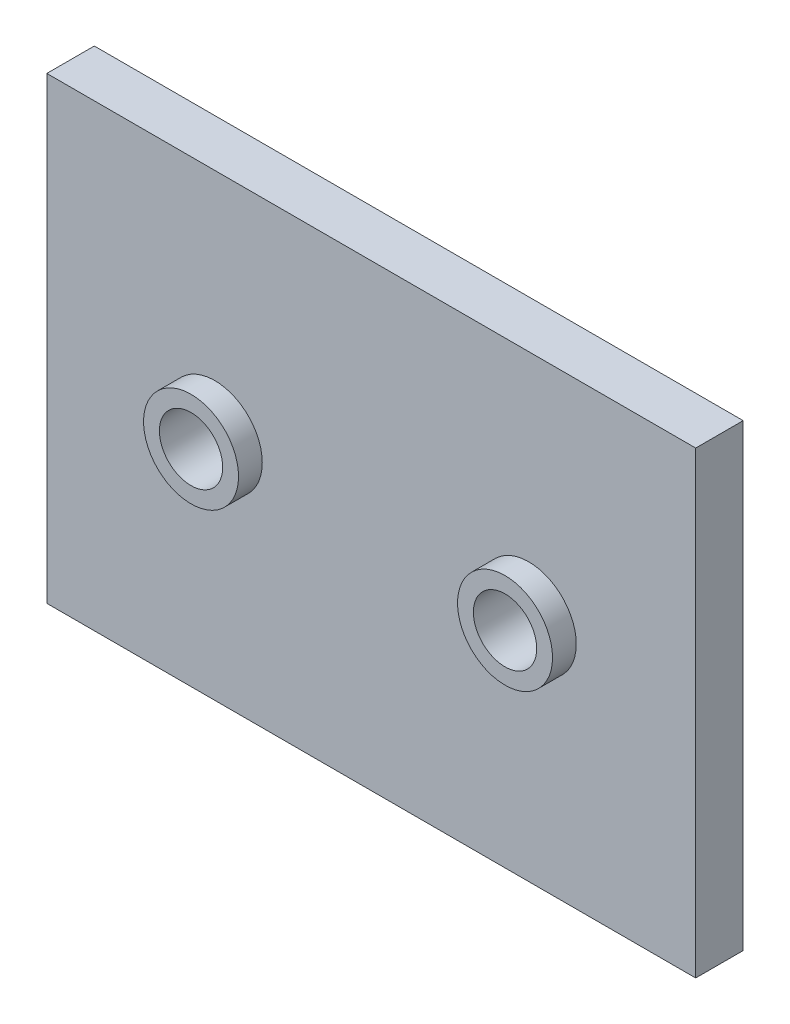
ISO-10303-21;
HEADER;
FILE_DESCRIPTION(('STEP AP214'),'2;1');
FILE_NAME('part.step','',(''),(''),'','','');
FILE_SCHEMA(('AUTOMOTIVE_DESIGN { 1 0 10303 214 1 1 1 1 }'));
ENDSEC;
DATA;
#1=APPLICATION_CONTEXT('core data for automotive mechanical design processes');
#2=APPLICATION_PROTOCOL_DEFINITION('international standard','automotive_design',2000,#1);
#3=PRODUCT_CONTEXT('',#1,'mechanical');
#4=PRODUCT('Part','Part','',(#3));
#5=PRODUCT_RELATED_PRODUCT_CATEGORY('part','',(#4));
#6=PRODUCT_DEFINITION_FORMATION('','',#4);
#7=PRODUCT_DEFINITION_CONTEXT('part definition',#1,'design');
#8=PRODUCT_DEFINITION('design','',#6,#7);
#9=PRODUCT_DEFINITION_SHAPE('','',#8);
#10=(LENGTH_UNIT() NAMED_UNIT(*) SI_UNIT(.MILLI.,.METRE.));
#11=(NAMED_UNIT(*) PLANE_ANGLE_UNIT() SI_UNIT($,.RADIAN.));
#12=(NAMED_UNIT(*) SI_UNIT($,.STERADIAN.) SOLID_ANGLE_UNIT());
#13=UNCERTAINTY_MEASURE_WITH_UNIT(LENGTH_MEASURE(1.E-05),#10,'distance_accuracy_value','');
#14=(GEOMETRIC_REPRESENTATION_CONTEXT(3) GLOBAL_UNCERTAINTY_ASSIGNED_CONTEXT((#13)) GLOBAL_UNIT_ASSIGNED_CONTEXT((#10,
#11,#12)) REPRESENTATION_CONTEXT('',''));
#15=CARTESIAN_POINT('',(0.,0.,0.));
#16=DIRECTION('',(0.,0.,1.));
#17=DIRECTION('',(1.,0.,0.));
#18=AXIS2_PLACEMENT_3D('',#15,#16,#17);
#19=CARTESIAN_POINT('',(48.7956932814946,15.,3.));
#20=DIRECTION('',(-1.,0.,0.));
#21=DIRECTION('',(0.,0.,1.));
#22=AXIS2_PLACEMENT_3D('',#19,#20,#21);
#23=PLANE('',#22);
#24=DIRECTION('',(0.,1.,0.));
#25=VECTOR('',#24,1.);
#26=CARTESIAN_POINT('',(48.7956932814946,15.,0.));
#27=LINE('',#26,#25);
#28=CARTESIAN_POINT('',(48.7956932814946,-14.,0.));
#29=VERTEX_POINT('',#28);
#30=CARTESIAN_POINT('',(48.7956932814946,15.,0.));
#31=VERTEX_POINT('',#30);
#32=EDGE_CURVE('E96',#29,#31,#27,.T.);
#33=ORIENTED_EDGE('',*,*,#32,.T.);
#34=DIRECTION('',(0.,0.,-1.));
#35=VECTOR('',#34,1.);
#36=CARTESIAN_POINT('',(48.7956932814946,15.,3.));
#37=LINE('',#36,#35);
#38=CARTESIAN_POINT('',(48.7956932814946,15.,3.));
#39=VERTEX_POINT('',#38);
#40=EDGE_CURVE('E11',#39,#31,#37,.T.);
#41=ORIENTED_EDGE('',*,*,#40,.F.);
#42=DIRECTION('',(0.,1.,0.));
#43=VECTOR('',#42,1.);
#44=CARTESIAN_POINT('',(48.7956932814946,15.,3.));
#45=LINE('',#44,#43);
#46=CARTESIAN_POINT('',(48.7956932814946,-14.,3.));
#47=VERTEX_POINT('',#46);
#48=EDGE_CURVE('E84',#47,#39,#45,.T.);
#49=ORIENTED_EDGE('',*,*,#48,.F.);
#50=DIRECTION('',(0.,0.,-1.));
#51=VECTOR('',#50,1.);
#52=CARTESIAN_POINT('',(48.7956932814946,-14.,3.));
#53=LINE('',#52,#51);
#54=EDGE_CURVE('E92',#47,#29,#53,.T.);
#55=ORIENTED_EDGE('',*,*,#54,.T.);
#56=EDGE_LOOP('',(#33,#41,#49,#55));
#57=FACE_BOUND('',#56,.T.);
#58=ADVANCED_FACE('F33',(#57),#23,.F.);
#59=CARTESIAN_POINT('',(7.79569328149461,15.,3.));
#60=DIRECTION('',(0.,-1.,0.));
#61=DIRECTION('',(0.,0.,-1.));
#62=AXIS2_PLACEMENT_3D('',#59,#60,#61);
#63=PLANE('',#62);
#64=DIRECTION('',(-1.,0.,0.));
#65=VECTOR('',#64,1.);
#66=CARTESIAN_POINT('',(7.79569328149461,15.,0.));
#67=LINE('',#66,#65);
#68=CARTESIAN_POINT('',(7.79569328149461,15.,0.));
#69=VERTEX_POINT('',#68);
#70=EDGE_CURVE('E88',#31,#69,#67,.T.);
#71=ORIENTED_EDGE('',*,*,#70,.T.);
#72=DIRECTION('',(0.,0.,-1.));
#73=VECTOR('',#72,1.);
#74=CARTESIAN_POINT('',(7.79569328149461,15.,3.));
#75=LINE('',#74,#73);
#76=CARTESIAN_POINT('',(7.79569328149461,15.,3.));
#77=VERTEX_POINT('',#76);
#78=EDGE_CURVE('E41',#77,#69,#75,.T.);
#79=ORIENTED_EDGE('',*,*,#78,.F.);
#80=DIRECTION('',(-1.,0.,0.));
#81=VECTOR('',#80,1.);
#82=CARTESIAN_POINT('',(7.79569328149461,15.,3.));
#83=LINE('',#82,#81);
#84=EDGE_CURVE('E79',#39,#77,#83,.T.);
#85=ORIENTED_EDGE('',*,*,#84,.F.);
#86=ORIENTED_EDGE('',*,*,#40,.T.);
#87=EDGE_LOOP('',(#71,#79,#85,#86));
#88=FACE_BOUND('',#87,.T.);
#89=ADVANCED_FACE('F87',(#88),#63,.F.);
#90=CARTESIAN_POINT('',(7.79569328149461,15.,3.));
#91=DIRECTION('',(1.,0.,0.));
#92=DIRECTION('',(0.,1.,0.));
#93=AXIS2_PLACEMENT_3D('',#90,#91,#92);
#94=PLANE('',#93);
#95=DIRECTION('',(0.,-1.,0.));
#96=VECTOR('',#95,1.);
#97=CARTESIAN_POINT('',(7.79569328149461,15.,0.));
#98=LINE('',#97,#96);
#99=CARTESIAN_POINT('',(7.79569328149461,-14.,0.));
#100=VERTEX_POINT('',#99);
#101=EDGE_CURVE('E66',#69,#100,#98,.T.);
#102=ORIENTED_EDGE('',*,*,#101,.T.);
#103=DIRECTION('',(0.,0.,-1.));
#104=VECTOR('',#103,1.);
#105=CARTESIAN_POINT('',(7.79569328149461,-14.,3.));
#106=LINE('',#105,#104);
#107=CARTESIAN_POINT('',(7.79569328149461,-14.,3.));
#108=VERTEX_POINT('',#107);
#109=EDGE_CURVE('E89',#108,#100,#106,.T.);
#110=ORIENTED_EDGE('',*,*,#109,.F.);
#111=DIRECTION('',(0.,-1.,0.));
#112=VECTOR('',#111,1.);
#113=CARTESIAN_POINT('',(7.79569328149461,15.,3.));
#114=LINE('',#113,#112);
#115=EDGE_CURVE('E82',#77,#108,#114,.T.);
#116=ORIENTED_EDGE('',*,*,#115,.F.);
#117=ORIENTED_EDGE('',*,*,#78,.T.);
#118=EDGE_LOOP('',(#102,#110,#116,#117));
#119=FACE_BOUND('',#118,.T.);
#120=ADVANCED_FACE('F90',(#119),#94,.F.);
#121=CARTESIAN_POINT('',(7.79569328149461,-14.,3.));
#122=DIRECTION('',(0.,1.,0.));
#123=DIRECTION('',(0.,0.,1.));
#124=AXIS2_PLACEMENT_3D('',#121,#122,#123);
#125=PLANE('',#124);
#126=DIRECTION('',(1.,0.,0.));
#127=VECTOR('',#126,1.);
#128=CARTESIAN_POINT('',(7.79569328149461,-14.,0.));
#129=LINE('',#128,#127);
#130=EDGE_CURVE('E72',#100,#29,#129,.T.);
#131=ORIENTED_EDGE('',*,*,#130,.T.);
#132=ORIENTED_EDGE('',*,*,#54,.F.);
#133=DIRECTION('',(1.,0.,0.));
#134=VECTOR('',#133,1.);
#135=CARTESIAN_POINT('',(7.79569328149461,-14.,3.));
#136=LINE('',#135,#134);
#137=EDGE_CURVE('E49',#108,#47,#136,.T.);
#138=ORIENTED_EDGE('',*,*,#137,.F.);
#139=ORIENTED_EDGE('',*,*,#109,.T.);
#140=EDGE_LOOP('',(#131,#132,#138,#139));
#141=FACE_BOUND('',#140,.T.);
#142=ADVANCED_FACE('F104',(#141),#125,.F.);
#143=CARTESIAN_POINT('',(28.2956932814946,0.5,3.));
#144=DIRECTION('',(0.,0.,1.));
#145=DIRECTION('',(1.,0.,0.));
#146=AXIS2_PLACEMENT_3D('',#143,#144,#145);
#147=PLANE('',#146);
#148=CARTESIAN_POINT('',(38.2486319289889,0.500000000000006,3.));
#149=DIRECTION('',(0.,0.,1.));
#150=DIRECTION('',(1.,0.,0.));
#151=AXIS2_PLACEMENT_3D('',#148,#149,#150);
#152=CIRCLE('',#151,3.);
#153=CARTESIAN_POINT('',(41.2486319289889,0.500000000000006,3.));
#154=VERTEX_POINT('',#153);
#155=EDGE_CURVE('E116',#154,#154,#152,.T.);
#156=ORIENTED_EDGE('',*,*,#155,.F.);
#157=EDGE_LOOP('',(#156));
#158=FACE_BOUND('',#157,.T.);
#159=CARTESIAN_POINT('',(18.4084488898902,0.500000000000006,3.));
#160=DIRECTION('',(0.,0.,1.));
#161=DIRECTION('',(1.,0.,0.));
#162=AXIS2_PLACEMENT_3D('',#159,#160,#161);
#163=CIRCLE('',#162,3.);
#164=CARTESIAN_POINT('',(21.4084488898902,0.500000000000006,3.));
#165=VERTEX_POINT('',#164);
#166=EDGE_CURVE('E110',#165,#165,#163,.T.);
#167=ORIENTED_EDGE('',*,*,#166,.F.);
#168=EDGE_LOOP('',(#167));
#169=FACE_BOUND('',#168,.T.);
#170=ORIENTED_EDGE('',*,*,#48,.T.);
#171=ORIENTED_EDGE('',*,*,#84,.T.);
#172=ORIENTED_EDGE('',*,*,#115,.T.);
#173=ORIENTED_EDGE('',*,*,#137,.T.);
#174=EDGE_LOOP('',(#170,#171,#172,#173));
#175=FACE_BOUND('',#174,.T.);
#176=ADVANCED_FACE('F80',(#158,#169,#175),#147,.T.);
#177=CARTESIAN_POINT('',(28.2956932814946,0.5,0.));
#178=DIRECTION('',(0.,0.,1.));
#179=DIRECTION('',(1.,0.,0.));
#180=AXIS2_PLACEMENT_3D('',#177,#178,#179);
#181=PLANE('',#180);
#182=CARTESIAN_POINT('',(18.4084488898902,0.500000000000006,0.));
#183=DIRECTION('',(0.,0.,1.));
#184=DIRECTION('',(1.,0.,0.));
#185=AXIS2_PLACEMENT_3D('',#182,#183,#184);
#186=CIRCLE('',#185,2.);
#187=CARTESIAN_POINT('',(20.4084488898902,0.500000000000006,0.));
#188=VERTEX_POINT('',#187);
#189=EDGE_CURVE('E127',#188,#188,#186,.T.);
#190=ORIENTED_EDGE('',*,*,#189,.T.);
#191=EDGE_LOOP('',(#190));
#192=FACE_BOUND('',#191,.T.);
#193=CARTESIAN_POINT('',(38.2486319289889,0.500000000000006,0.));
#194=DIRECTION('',(0.,0.,1.));
#195=DIRECTION('',(1.,0.,0.));
#196=AXIS2_PLACEMENT_3D('',#193,#194,#195);
#197=CIRCLE('',#196,2.);
#198=CARTESIAN_POINT('',(40.2486319289889,0.500000000000006,0.));
#199=VERTEX_POINT('',#198);
#200=EDGE_CURVE('E119',#199,#199,#197,.T.);
#201=ORIENTED_EDGE('',*,*,#200,.T.);
#202=EDGE_LOOP('',(#201));
#203=FACE_BOUND('',#202,.T.);
#204=ORIENTED_EDGE('',*,*,#32,.F.);
#205=ORIENTED_EDGE('',*,*,#130,.F.);
#206=ORIENTED_EDGE('',*,*,#101,.F.);
#207=ORIENTED_EDGE('',*,*,#70,.F.);
#208=EDGE_LOOP('',(#204,#205,#206,#207));
#209=FACE_BOUND('',#208,.T.);
#210=ADVANCED_FACE('F107',(#192,#203,#209),#181,.F.);
#211=CARTESIAN_POINT('',(18.4084488898902,0.500000000000006,4.5));
#212=DIRECTION('',(0.,0.,-1.));
#213=DIRECTION('',(-1.,0.,0.));
#214=AXIS2_PLACEMENT_3D('',#211,#212,#213);
#215=CYLINDRICAL_SURFACE('',#214,3.);
#216=CARTESIAN_POINT('',(18.4084488898902,0.500000000000006,4.5));
#217=DIRECTION('',(0.,0.,1.));
#218=DIRECTION('',(1.,0.,0.));
#219=AXIS2_PLACEMENT_3D('',#216,#217,#218);
#220=CIRCLE('',#219,3.);
#221=CARTESIAN_POINT('',(21.4084488898902,0.500000000000006,4.5));
#222=VERTEX_POINT('',#221);
#223=EDGE_CURVE('E99',#222,#222,#220,.T.);
#224=ORIENTED_EDGE('',*,*,#223,.F.);
#225=EDGE_LOOP('',(#224));
#226=FACE_BOUND('',#225,.T.);
#227=ORIENTED_EDGE('',*,*,#166,.T.);
#228=EDGE_LOOP('',(#227));
#229=FACE_BOUND('',#228,.T.);
#230=ADVANCED_FACE('F140',(#226,#229),#215,.T.);
#231=CARTESIAN_POINT('',(18.4084488898902,0.500000000000006,4.5));
#232=DIRECTION('',(0.,0.,1.));
#233=DIRECTION('',(1.,0.,0.));
#234=AXIS2_PLACEMENT_3D('',#231,#232,#233);
#235=PLANE('',#234);
#236=CARTESIAN_POINT('',(18.4084488898902,0.500000000000006,4.5));
#237=DIRECTION('',(0.,0.,1.));
#238=DIRECTION('',(1.,0.,0.));
#239=AXIS2_PLACEMENT_3D('',#236,#237,#238);
#240=CIRCLE('',#239,2.);
#241=CARTESIAN_POINT('',(20.4084488898902,0.500000000000006,4.5));
#242=VERTEX_POINT('',#241);
#243=EDGE_CURVE('E130',#242,#242,#240,.T.);
#244=ORIENTED_EDGE('',*,*,#243,.F.);
#245=EDGE_LOOP('',(#244));
#246=FACE_BOUND('',#245,.T.);
#247=ORIENTED_EDGE('',*,*,#223,.T.);
#248=EDGE_LOOP('',(#247));
#249=FACE_BOUND('',#248,.T.);
#250=ADVANCED_FACE('F136',(#246,#249),#235,.T.);
#251=CARTESIAN_POINT('',(38.2486319289889,0.500000000000006,4.5));
#252=DIRECTION('',(0.,0.,-1.));
#253=DIRECTION('',(-1.,0.,0.));
#254=AXIS2_PLACEMENT_3D('',#251,#252,#253);
#255=CYLINDRICAL_SURFACE('',#254,3.);
#256=CARTESIAN_POINT('',(38.2486319289889,0.500000000000006,4.5));
#257=DIRECTION('',(0.,0.,1.));
#258=DIRECTION('',(1.,0.,0.));
#259=AXIS2_PLACEMENT_3D('',#256,#257,#258);
#260=CIRCLE('',#259,3.);
#261=CARTESIAN_POINT('',(41.2486319289889,0.500000000000006,4.5));
#262=VERTEX_POINT('',#261);
#263=EDGE_CURVE('E113',#262,#262,#260,.T.);
#264=ORIENTED_EDGE('',*,*,#263,.F.);
#265=EDGE_LOOP('',(#264));
#266=FACE_BOUND('',#265,.T.);
#267=ORIENTED_EDGE('',*,*,#155,.T.);
#268=EDGE_LOOP('',(#267));
#269=FACE_BOUND('',#268,.T.);
#270=ADVANCED_FACE('F139',(#266,#269),#255,.T.);
#271=CARTESIAN_POINT('',(38.2486319289889,0.500000000000006,4.5));
#272=DIRECTION('',(0.,0.,1.));
#273=DIRECTION('',(1.,0.,0.));
#274=AXIS2_PLACEMENT_3D('',#271,#272,#273);
#275=PLANE('',#274);
#276=CARTESIAN_POINT('',(38.2486319289889,0.500000000000006,4.5));
#277=DIRECTION('',(0.,0.,1.));
#278=DIRECTION('',(1.,0.,0.));
#279=AXIS2_PLACEMENT_3D('',#276,#277,#278);
#280=CIRCLE('',#279,2.);
#281=CARTESIAN_POINT('',(40.2486319289889,0.500000000000006,4.5));
#282=VERTEX_POINT('',#281);
#283=EDGE_CURVE('E124',#282,#282,#280,.T.);
#284=ORIENTED_EDGE('',*,*,#283,.F.);
#285=EDGE_LOOP('',(#284));
#286=FACE_BOUND('',#285,.T.);
#287=ORIENTED_EDGE('',*,*,#263,.T.);
#288=EDGE_LOOP('',(#287));
#289=FACE_BOUND('',#288,.T.);
#290=ADVANCED_FACE('F206',(#286,#289),#275,.T.);
#291=CARTESIAN_POINT('',(38.2486319289889,0.500000000000006,4.5));
#292=DIRECTION('',(0.,0.,1.));
#293=DIRECTION('',(1.,0.,0.));
#294=AXIS2_PLACEMENT_3D('',#291,#292,#293);
#295=CYLINDRICAL_SURFACE('',#294,2.);
#296=ORIENTED_EDGE('',*,*,#200,.F.);
#297=EDGE_LOOP('',(#296));
#298=FACE_BOUND('',#297,.T.);
#299=ORIENTED_EDGE('',*,*,#283,.T.);
#300=EDGE_LOOP('',(#299));
#301=FACE_BOUND('',#300,.T.);
#302=ADVANCED_FACE('F216',(#298,#301),#295,.F.);
#303=CARTESIAN_POINT('',(18.4084488898902,0.500000000000006,4.5));
#304=DIRECTION('',(0.,0.,1.));
#305=DIRECTION('',(1.,0.,0.));
#306=AXIS2_PLACEMENT_3D('',#303,#304,#305);
#307=CYLINDRICAL_SURFACE('',#306,2.);
#308=ORIENTED_EDGE('',*,*,#189,.F.);
#309=EDGE_LOOP('',(#308));
#310=FACE_BOUND('',#309,.T.);
#311=ORIENTED_EDGE('',*,*,#243,.T.);
#312=EDGE_LOOP('',(#311));
#313=FACE_BOUND('',#312,.T.);
#314=ADVANCED_FACE('F134',(#310,#313),#307,.F.);
#315=CLOSED_SHELL('',(#58,#89,#120,#142,#176,#210,#230,#250,#270,#290,#302,#314));
#316=MANIFOLD_SOLID_BREP('B2',#315);
#317=ADVANCED_BREP_SHAPE_REPRESENTATION('',(#18,#316),#14);
#318=SHAPE_DEFINITION_REPRESENTATION(#9,#317);
ENDSEC;
END-ISO-10303-21;
